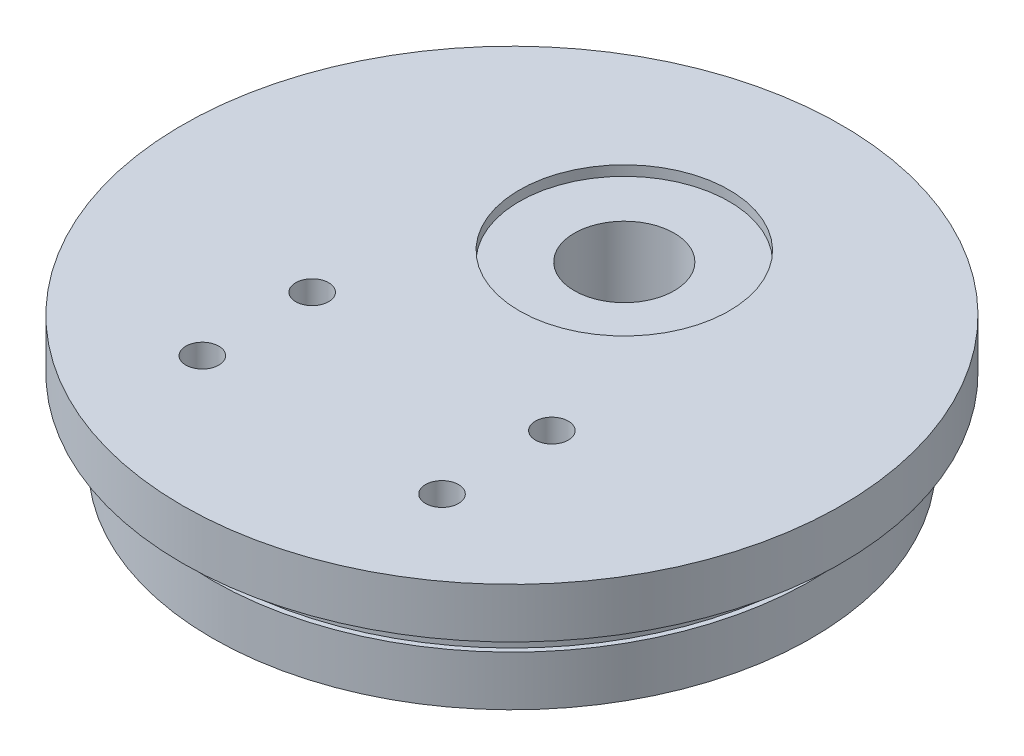
ISO-10303-21;
HEADER;
FILE_DESCRIPTION(('STEP AP214'),'2;1');
FILE_NAME('part.step','',(''),(''),'','','');
FILE_SCHEMA(('AUTOMOTIVE_DESIGN { 1 0 10303 214 1 1 1 1 }'));
ENDSEC;
DATA;
#1=APPLICATION_CONTEXT('core data for automotive mechanical design processes');
#2=APPLICATION_PROTOCOL_DEFINITION('international standard','automotive_design',2000,#1);
#3=PRODUCT_CONTEXT('',#1,'mechanical');
#4=PRODUCT('Part','Part','',(#3));
#5=PRODUCT_RELATED_PRODUCT_CATEGORY('part','',(#4));
#6=PRODUCT_DEFINITION_FORMATION('','',#4);
#7=PRODUCT_DEFINITION_CONTEXT('part definition',#1,'design');
#8=PRODUCT_DEFINITION('design','',#6,#7);
#9=PRODUCT_DEFINITION_SHAPE('','',#8);
#10=(LENGTH_UNIT() NAMED_UNIT(*) SI_UNIT(.MILLI.,.METRE.));
#11=(NAMED_UNIT(*) PLANE_ANGLE_UNIT() SI_UNIT($,.RADIAN.));
#12=(NAMED_UNIT(*) SI_UNIT($,.STERADIAN.) SOLID_ANGLE_UNIT());
#13=UNCERTAINTY_MEASURE_WITH_UNIT(LENGTH_MEASURE(1.E-05),#10,'distance_accuracy_value','');
#14=(GEOMETRIC_REPRESENTATION_CONTEXT(3) GLOBAL_UNCERTAINTY_ASSIGNED_CONTEXT((#13)) GLOBAL_UNIT_ASSIGNED_CONTEXT((#10,
#11,#12)) REPRESENTATION_CONTEXT('',''));
#15=CARTESIAN_POINT('',(0.,0.,0.));
#16=DIRECTION('',(0.,0.,1.));
#17=DIRECTION('',(1.,0.,0.));
#18=AXIS2_PLACEMENT_3D('',#15,#16,#17);
#19=CARTESIAN_POINT('',(0.,-13.,-11.25));
#20=DIRECTION('',(0.,1.,0.));
#21=DIRECTION('',(0.,0.,1.));
#22=AXIS2_PLACEMENT_3D('',#19,#20,#21);
#23=CYLINDRICAL_SURFACE('',#22,5.);
#24=CARTESIAN_POINT('',(0.,-13.,-11.25));
#25=DIRECTION('',(0.,1.,0.));
#26=DIRECTION('',(0.,0.,1.));
#27=AXIS2_PLACEMENT_3D('',#24,#25,#26);
#28=CIRCLE('',#27,5.);
#29=CARTESIAN_POINT('',(0.,-13.,-6.25));
#30=VERTEX_POINT('',#29);
#31=EDGE_CURVE('E145',#30,#30,#28,.T.);
#32=CARTESIAN_POINT('',(0.,-1.,-11.25));
#33=DIRECTION('',(0.,1.,0.));
#34=DIRECTION('',(0.,0.,1.));
#35=AXIS2_PLACEMENT_3D('',#32,#33,#34);
#36=CIRCLE('',#35,5.);
#37=CARTESIAN_POINT('',(0.,-1.,-6.25));
#38=VERTEX_POINT('',#37);
#39=EDGE_CURVE('E38',#38,#38,#36,.F.);
#40=CARTESIAN_POINT('',(0.,-13.,-6.25));
#41=CARTESIAN_POINT('',(0.,-12.875,-6.25));
#42=CARTESIAN_POINT('',(0.,-12.75,-6.25));
#43=CARTESIAN_POINT('',(0.,-12.5,-6.25));
#44=CARTESIAN_POINT('',(0.,-12.375,-6.25));
#45=CARTESIAN_POINT('',(0.,-12.125,-6.25));
#46=CARTESIAN_POINT('',(0.,-12.,-6.25));
#47=CARTESIAN_POINT('',(0.,-11.75,-6.25));
#48=CARTESIAN_POINT('',(0.,-11.625,-6.25));
#49=CARTESIAN_POINT('',(0.,-11.375,-6.25));
#50=CARTESIAN_POINT('',(0.,-11.25,-6.25));
#51=CARTESIAN_POINT('',(0.,-11.,-6.25));
#52=CARTESIAN_POINT('',(0.,-10.875,-6.25));
#53=CARTESIAN_POINT('',(0.,-10.625,-6.25));
#54=CARTESIAN_POINT('',(0.,-10.5,-6.25));
#55=CARTESIAN_POINT('',(0.,-10.25,-6.25));
#56=CARTESIAN_POINT('',(0.,-10.125,-6.25));
#57=CARTESIAN_POINT('',(0.,-9.87500000000001,-6.25));
#58=CARTESIAN_POINT('',(0.,-9.75000000000001,-6.25));
#59=CARTESIAN_POINT('',(0.,-9.50000000000001,-6.25));
#60=CARTESIAN_POINT('',(0.,-9.37500000000001,-6.25));
#61=CARTESIAN_POINT('',(0.,-9.12500000000001,-6.25));
#62=CARTESIAN_POINT('',(0.,-9.00000000000001,-6.25));
#63=CARTESIAN_POINT('',(0.,-8.75,-6.25));
#64=CARTESIAN_POINT('',(0.,-8.625,-6.25));
#65=CARTESIAN_POINT('',(0.,-8.375,-6.25));
#66=CARTESIAN_POINT('',(0.,-8.25,-6.25));
#67=CARTESIAN_POINT('',(0.,-8.,-6.25));
#68=CARTESIAN_POINT('',(0.,-7.87500000000001,-6.25));
#69=CARTESIAN_POINT('',(0.,-7.62500000000001,-6.25));
#70=CARTESIAN_POINT('',(0.,-7.50000000000001,-6.25));
#71=CARTESIAN_POINT('',(0.,-7.25,-6.25));
#72=CARTESIAN_POINT('',(0.,-7.125,-6.25));
#73=CARTESIAN_POINT('',(0.,-6.875,-6.25));
#74=CARTESIAN_POINT('',(0.,-6.75,-6.25));
#75=CARTESIAN_POINT('',(0.,-6.5,-6.25));
#76=CARTESIAN_POINT('',(0.,-6.375,-6.25));
#77=CARTESIAN_POINT('',(0.,-6.125,-6.25));
#78=CARTESIAN_POINT('',(0.,-6.,-6.25));
#79=CARTESIAN_POINT('',(0.,-5.75,-6.25));
#80=CARTESIAN_POINT('',(0.,-5.625,-6.25));
#81=CARTESIAN_POINT('',(0.,-5.375,-6.25));
#82=CARTESIAN_POINT('',(0.,-5.25,-6.25));
#83=CARTESIAN_POINT('',(0.,-5.,-6.25));
#84=CARTESIAN_POINT('',(0.,-4.875,-6.25));
#85=CARTESIAN_POINT('',(0.,-4.625,-6.25));
#86=CARTESIAN_POINT('',(0.,-4.5,-6.25));
#87=CARTESIAN_POINT('',(0.,-4.25,-6.25));
#88=CARTESIAN_POINT('',(0.,-4.125,-6.25));
#89=CARTESIAN_POINT('',(0.,-3.875,-6.25));
#90=CARTESIAN_POINT('',(0.,-3.75,-6.25));
#91=CARTESIAN_POINT('',(0.,-3.5,-6.25));
#92=CARTESIAN_POINT('',(0.,-3.375,-6.25));
#93=CARTESIAN_POINT('',(0.,-3.125,-6.25));
#94=CARTESIAN_POINT('',(0.,-3.,-6.25));
#95=CARTESIAN_POINT('',(0.,-2.75,-6.25));
#96=CARTESIAN_POINT('',(0.,-2.625,-6.25));
#97=CARTESIAN_POINT('',(0.,-2.375,-6.25));
#98=CARTESIAN_POINT('',(0.,-2.25,-6.25));
#99=CARTESIAN_POINT('',(0.,-2.,-6.25));
#100=CARTESIAN_POINT('',(0.,-1.875,-6.25));
#101=CARTESIAN_POINT('',(0.,-1.625,-6.25));
#102=CARTESIAN_POINT('',(0.,-1.5,-6.25));
#103=CARTESIAN_POINT('',(0.,-1.25,-6.25));
#104=CARTESIAN_POINT('',(0.,-1.125,-6.25));
#105=CARTESIAN_POINT('',(0.,-1.,-6.25));
#106=B_SPLINE_CURVE_WITH_KNOTS('',3,(#40,#41,#42,#43,#44,#45,#46,#47,#48,#49,#50,#51,#52,#53,
#54,#55,#56,#57,#58,#59,#60,#61,#62,#63,#64,#65,#66,#67,#68,#69,#70,#71,#72,#73,#74,#75,#76,#77,
#78,#79,#80,#81,#82,#83,#84,#85,#86,#87,#88,#89,#90,#91,#92,#93,#94,#95,#96,#97,#98,#99,#100,
#101,#102,#103,#104,#105),.UNSPECIFIED.,.F.,.F.,(4,2,2,2,2,2,2,2,2,2,2,2,2,2,2,2,2,2,2,2,2,2,2,
2,2,2,2,2,2,2,2,2,4),(0.,0.374999999999999,0.749999999999999,1.125,1.5,1.875,2.25,2.625,3.,
3.375,3.75,4.125,4.5,4.875,5.25,5.625,6.,6.375,6.75,7.125,7.5,7.875,8.25,8.625,9.,9.375,9.75,
10.125,10.5,10.875,11.25,11.625,12.),.UNSPECIFIED.);
#107=EDGE_CURVE('BSEAM34',#30,#38,#106,.T.);
#108=ORIENTED_EDGE('',*,*,#31,.F.);
#109=ORIENTED_EDGE('',*,*,#39,.F.);
#110=ORIENTED_EDGE('',*,*,#107,.T.);
#111=ORIENTED_EDGE('',*,*,#107,.F.);
#112=EDGE_LOOP('',(#108,#110,#109,#111));
#113=FACE_BOUND('',#112,.T.);
#114=ADVANCED_FACE('F34',(#113),#23,.F.);
#115=CARTESIAN_POINT('',(0.,0.,0.));
#116=DIRECTION('',(0.,1.,0.));
#117=DIRECTION('',(0.,0.,1.));
#118=AXIS2_PLACEMENT_3D('',#115,#116,#117);
#119=PLANE('',#118);
#120=CARTESIAN_POINT('',(0.,0.,-11.25));
#121=DIRECTION('',(0.,1.,0.));
#122=DIRECTION('',(0.,0.,1.));
#123=AXIS2_PLACEMENT_3D('',#120,#121,#122);
#124=CIRCLE('',#123,10.5);
#125=CARTESIAN_POINT('',(0.,0.,-0.749999999999999));
#126=VERTEX_POINT('',#125);
#127=EDGE_CURVE('E173',#126,#126,#124,.T.);
#128=ORIENTED_EDGE('',*,*,#127,.F.);
#129=EDGE_LOOP('',(#128));
#130=FACE_BOUND('',#129,.T.);
#131=CARTESIAN_POINT('',(12.,0.,8.));
#132=DIRECTION('',(0.,1.,0.));
#133=DIRECTION('',(0.,0.,1.));
#134=AXIS2_PLACEMENT_3D('',#131,#132,#133);
#135=CIRCLE('',#134,1.64999999999999);
#136=CARTESIAN_POINT('',(12.,0.,9.64999999999999));
#137=VERTEX_POINT('',#136);
#138=EDGE_CURVE('E85',#137,#137,#135,.T.);
#139=ORIENTED_EDGE('',*,*,#138,.F.);
#140=EDGE_LOOP('',(#139));
#141=FACE_BOUND('',#140,.T.);
#142=CARTESIAN_POINT('',(-12.,0.,8.));
#143=DIRECTION('',(0.,1.,0.));
#144=DIRECTION('',(0.,0.,1.));
#145=AXIS2_PLACEMENT_3D('',#142,#143,#144);
#146=CIRCLE('',#145,1.64999999999999);
#147=CARTESIAN_POINT('',(-12.,0.,9.64999999999999));
#148=VERTEX_POINT('',#147);
#149=EDGE_CURVE('E84',#148,#148,#146,.T.);
#150=ORIENTED_EDGE('',*,*,#149,.F.);
#151=EDGE_LOOP('',(#150));
#152=FACE_BOUND('',#151,.T.);
#153=CARTESIAN_POINT('',(12.,0.,19.));
#154=DIRECTION('',(0.,1.,0.));
#155=DIRECTION('',(0.,0.,1.));
#156=AXIS2_PLACEMENT_3D('',#153,#154,#155);
#157=CIRCLE('',#156,1.64999999999999);
#158=CARTESIAN_POINT('',(12.,0.,20.65));
#159=VERTEX_POINT('',#158);
#160=EDGE_CURVE('E97',#159,#159,#157,.T.);
#161=ORIENTED_EDGE('',*,*,#160,.F.);
#162=EDGE_LOOP('',(#161));
#163=FACE_BOUND('',#162,.T.);
#164=CARTESIAN_POINT('',(-12.,0.,19.));
#165=DIRECTION('',(0.,1.,0.));
#166=DIRECTION('',(0.,0.,1.));
#167=AXIS2_PLACEMENT_3D('',#164,#165,#166);
#168=CIRCLE('',#167,1.64999999999999);
#169=CARTESIAN_POINT('',(-12.,0.,20.65));
#170=VERTEX_POINT('',#169);
#171=EDGE_CURVE('E103',#170,#170,#168,.T.);
#172=ORIENTED_EDGE('',*,*,#171,.F.);
#173=EDGE_LOOP('',(#172));
#174=FACE_BOUND('',#173,.T.);
#175=CARTESIAN_POINT('',(0.,0.,0.));
#176=DIRECTION('',(0.,1.,0.));
#177=DIRECTION('',(0.,0.,1.));
#178=AXIS2_PLACEMENT_3D('',#175,#176,#177);
#179=CIRCLE('',#178,33.);
#180=CARTESIAN_POINT('',(0.,0.,33.));
#181=VERTEX_POINT('',#180);
#182=EDGE_CURVE('E11',#181,#181,#179,.T.);
#183=ORIENTED_EDGE('',*,*,#182,.T.);
#184=EDGE_LOOP('',(#183));
#185=FACE_BOUND('',#184,.T.);
#186=ADVANCED_FACE('F36',(#130,#141,#152,#163,#174,#185),#119,.T.);
#187=CARTESIAN_POINT('',(0.,0.,0.));
#188=DIRECTION('',(0.,1.,0.));
#189=DIRECTION('',(0.,0.,1.));
#190=AXIS2_PLACEMENT_3D('',#187,#188,#189);
#191=CYLINDRICAL_SURFACE('',#190,33.);
#192=CARTESIAN_POINT('',(0.,-5.,0.));
#193=DIRECTION('',(0.,1.,0.));
#194=DIRECTION('',(0.,0.,1.));
#195=AXIS2_PLACEMENT_3D('',#192,#193,#194);
#196=CIRCLE('',#195,33.);
#197=CARTESIAN_POINT('',(0.,-5.,33.));
#198=VERTEX_POINT('',#197);
#199=EDGE_CURVE('E43',#198,#198,#196,.T.);
#200=ORIENTED_EDGE('',*,*,#199,.T.);
#201=EDGE_LOOP('',(#200));
#202=FACE_BOUND('',#201,.T.);
#203=ORIENTED_EDGE('',*,*,#182,.F.);
#204=EDGE_LOOP('',(#203));
#205=FACE_BOUND('',#204,.T.);
#206=ADVANCED_FACE('F154',(#202,#205),#191,.T.);
#207=CARTESIAN_POINT('',(-33.,-5.,0.));
#208=DIRECTION('',(0.,-1.,0.));
#209=DIRECTION('',(0.,0.,-1.));
#210=AXIS2_PLACEMENT_3D('',#207,#208,#209);
#211=PLANE('',#210);
#212=ORIENTED_EDGE('',*,*,#199,.F.);
#213=EDGE_LOOP('',(#212));
#214=FACE_BOUND('',#213,.T.);
#215=CARTESIAN_POINT('',(0.,-5.,0.));
#216=DIRECTION('',(0.,1.,0.));
#217=DIRECTION('',(0.,0.,1.));
#218=AXIS2_PLACEMENT_3D('',#215,#216,#217);
#219=CIRCLE('',#218,29.5);
#220=CARTESIAN_POINT('',(0.,-5.,29.5));
#221=VERTEX_POINT('',#220);
#222=EDGE_CURVE('E164',#221,#221,#219,.T.);
#223=ORIENTED_EDGE('',*,*,#222,.T.);
#224=EDGE_LOOP('',(#223));
#225=FACE_BOUND('',#224,.T.);
#226=ADVANCED_FACE('F157',(#214,#225),#211,.T.);
#227=CARTESIAN_POINT('',(0.,0.,0.));
#228=DIRECTION('',(0.,1.,0.));
#229=DIRECTION('',(0.,0.,1.));
#230=AXIS2_PLACEMENT_3D('',#227,#228,#229);
#231=CYLINDRICAL_SURFACE('',#230,30.);
#232=CARTESIAN_POINT('',(0.,-8.,0.));
#233=DIRECTION('',(0.,1.,0.));
#234=DIRECTION('',(0.,0.,1.));
#235=AXIS2_PLACEMENT_3D('',#232,#233,#234);
#236=CIRCLE('',#235,30.);
#237=CARTESIAN_POINT('',(0.,-8.,30.));
#238=VERTEX_POINT('',#237);
#239=EDGE_CURVE('E91',#238,#238,#236,.T.);
#240=ORIENTED_EDGE('',*,*,#239,.F.);
#241=EDGE_LOOP('',(#240));
#242=FACE_BOUND('',#241,.T.);
#243=CARTESIAN_POINT('',(0.,-13.,0.));
#244=DIRECTION('',(0.,1.,0.));
#245=DIRECTION('',(0.,0.,1.));
#246=AXIS2_PLACEMENT_3D('',#243,#244,#245);
#247=CIRCLE('',#246,30.);
#248=CARTESIAN_POINT('',(0.,-13.,30.));
#249=VERTEX_POINT('',#248);
#250=EDGE_CURVE('E148',#249,#249,#247,.T.);
#251=ORIENTED_EDGE('',*,*,#250,.T.);
#252=EDGE_LOOP('',(#251));
#253=FACE_BOUND('',#252,.T.);
#254=ADVANCED_FACE('F160',(#242,#253),#231,.T.);
#255=CARTESIAN_POINT('',(-30.,-13.,0.));
#256=DIRECTION('',(0.,-1.,0.));
#257=DIRECTION('',(0.,0.,-1.));
#258=AXIS2_PLACEMENT_3D('',#255,#256,#257);
#259=PLANE('',#258);
#260=CARTESIAN_POINT('',(18.75,-13.,-14.));
#261=DIRECTION('',(0.,-1.,0.));
#262=DIRECTION('',(0.,0.,-1.));
#263=AXIS2_PLACEMENT_3D('',#260,#261,#262);
#264=CIRCLE('',#263,1.65);
#265=CARTESIAN_POINT('',(18.75,-13.,-15.65));
#266=VERTEX_POINT('',#265);
#267=EDGE_CURVE('E109',#266,#266,#264,.T.);
#268=ORIENTED_EDGE('',*,*,#267,.F.);
#269=EDGE_LOOP('',(#268));
#270=FACE_BOUND('',#269,.T.);
#271=CARTESIAN_POINT('',(-18.75,-13.,-14.0000000000003));
#272=DIRECTION('',(0.,-1.,0.));
#273=DIRECTION('',(0.,0.,-1.));
#274=AXIS2_PLACEMENT_3D('',#271,#272,#273);
#275=CIRCLE('',#274,1.65);
#276=CARTESIAN_POINT('',(-18.75,-13.,-15.6500000000003));
#277=VERTEX_POINT('',#276);
#278=EDGE_CURVE('E115',#277,#277,#275,.T.);
#279=ORIENTED_EDGE('',*,*,#278,.F.);
#280=EDGE_LOOP('',(#279));
#281=FACE_BOUND('',#280,.T.);
#282=CARTESIAN_POINT('',(18.75,-13.,0.));
#283=DIRECTION('',(0.,-1.,0.));
#284=DIRECTION('',(0.,0.,-1.));
#285=AXIS2_PLACEMENT_3D('',#282,#283,#284);
#286=CIRCLE('',#285,1.65);
#287=CARTESIAN_POINT('',(18.75,-13.,-1.65));
#288=VERTEX_POINT('',#287);
#289=EDGE_CURVE('E121',#288,#288,#286,.T.);
#290=ORIENTED_EDGE('',*,*,#289,.F.);
#291=EDGE_LOOP('',(#290));
#292=FACE_BOUND('',#291,.T.);
#293=CARTESIAN_POINT('',(-18.75,-13.,-2.61943244872498E-13));
#294=DIRECTION('',(0.,-1.,0.));
#295=DIRECTION('',(0.,0.,-1.));
#296=AXIS2_PLACEMENT_3D('',#293,#294,#295);
#297=CIRCLE('',#296,1.65);
#298=CARTESIAN_POINT('',(-18.75,-13.,-1.65000000000026));
#299=VERTEX_POINT('',#298);
#300=EDGE_CURVE('E127',#299,#299,#297,.T.);
#301=ORIENTED_EDGE('',*,*,#300,.F.);
#302=EDGE_LOOP('',(#301));
#303=FACE_BOUND('',#302,.T.);
#304=CARTESIAN_POINT('',(18.7499999999999,-13.,14.));
#305=DIRECTION('',(0.,-1.,0.));
#306=DIRECTION('',(0.,0.,-1.));
#307=AXIS2_PLACEMENT_3D('',#304,#305,#306);
#308=CIRCLE('',#307,1.65);
#309=CARTESIAN_POINT('',(18.7499999999999,-13.,12.35));
#310=VERTEX_POINT('',#309);
#311=EDGE_CURVE('E133',#310,#310,#308,.T.);
#312=ORIENTED_EDGE('',*,*,#311,.F.);
#313=EDGE_LOOP('',(#312));
#314=FACE_BOUND('',#313,.T.);
#315=CARTESIAN_POINT('',(-18.7500000000001,-13.,13.9999999999997));
#316=DIRECTION('',(0.,-1.,0.));
#317=DIRECTION('',(0.,0.,-1.));
#318=AXIS2_PLACEMENT_3D('',#315,#316,#317);
#319=CIRCLE('',#318,1.65);
#320=CARTESIAN_POINT('',(-18.7500000000001,-13.,12.3499999999997));
#321=VERTEX_POINT('',#320);
#322=EDGE_CURVE('E139',#321,#321,#319,.T.);
#323=ORIENTED_EDGE('',*,*,#322,.F.);
#324=EDGE_LOOP('',(#323));
#325=FACE_BOUND('',#324,.T.);
#326=ORIENTED_EDGE('',*,*,#31,.T.);
#327=EDGE_LOOP('',(#326));
#328=FACE_BOUND('',#327,.T.);
#329=ORIENTED_EDGE('',*,*,#250,.F.);
#330=EDGE_LOOP('',(#329));
#331=FACE_BOUND('',#330,.T.);
#332=ADVANCED_FACE('F182',(#270,#281,#292,#303,#314,#325,#328,#331),#259,.T.);
#333=CARTESIAN_POINT('',(-18.7500000000001,-8.,13.9999999999997));
#334=DIRECTION('',(0.,-1.,0.));
#335=DIRECTION('',(0.,0.,-1.));
#336=AXIS2_PLACEMENT_3D('',#333,#334,#335);
#337=CONICAL_SURFACE('',#336,1.65,1.02974425867665);
#338=CARTESIAN_POINT('',(-18.7500000000001,-7.00857997860453,13.9999999999997));
#339=VERTEX_POINT('',#338);
#340=VERTEX_LOOP('',#339);
#341=FACE_BOUND('',#340,.T.);
#342=CARTESIAN_POINT('',(-18.7500000000001,-8.,13.9999999999997));
#343=DIRECTION('',(0.,-1.,0.));
#344=DIRECTION('',(0.,0.,-1.));
#345=AXIS2_PLACEMENT_3D('',#342,#343,#344);
#346=CIRCLE('',#345,1.65);
#347=CARTESIAN_POINT('',(-18.7500000000001,-8.,12.3499999999997));
#348=VERTEX_POINT('',#347);
#349=EDGE_CURVE('E142',#348,#348,#346,.T.);
#350=ORIENTED_EDGE('',*,*,#349,.T.);
#351=EDGE_LOOP('',(#350));
#352=FACE_BOUND('',#351,.T.);
#353=ADVANCED_FACE('F187',(#341,#352),#337,.F.);
#354=CARTESIAN_POINT('',(-18.7500000000001,-13.,13.9999999999997));
#355=DIRECTION('',(0.,-1.,0.));
#356=DIRECTION('',(0.,0.,-1.));
#357=AXIS2_PLACEMENT_3D('',#354,#355,#356);
#358=CYLINDRICAL_SURFACE('',#357,1.65);
#359=ORIENTED_EDGE('',*,*,#349,.F.);
#360=EDGE_LOOP('',(#359));
#361=FACE_BOUND('',#360,.T.);
#362=ORIENTED_EDGE('',*,*,#322,.T.);
#363=EDGE_LOOP('',(#362));
#364=FACE_BOUND('',#363,.T.);
#365=ADVANCED_FACE('F193',(#361,#364),#358,.F.);
#366=CARTESIAN_POINT('',(18.7499999999999,-8.,14.));
#367=DIRECTION('',(0.,-1.,0.));
#368=DIRECTION('',(0.,0.,-1.));
#369=AXIS2_PLACEMENT_3D('',#366,#367,#368);
#370=CONICAL_SURFACE('',#369,1.65,1.02974425867665);
#371=CARTESIAN_POINT('',(18.7499999999999,-7.00857997860453,14.));
#372=VERTEX_POINT('',#371);
#373=VERTEX_LOOP('',#372);
#374=FACE_BOUND('',#373,.T.);
#375=CARTESIAN_POINT('',(18.7499999999999,-8.,14.));
#376=DIRECTION('',(0.,-1.,0.));
#377=DIRECTION('',(0.,0.,-1.));
#378=AXIS2_PLACEMENT_3D('',#375,#376,#377);
#379=CIRCLE('',#378,1.65);
#380=CARTESIAN_POINT('',(18.7499999999999,-8.,12.35));
#381=VERTEX_POINT('',#380);
#382=EDGE_CURVE('E136',#381,#381,#379,.T.);
#383=ORIENTED_EDGE('',*,*,#382,.T.);
#384=EDGE_LOOP('',(#383));
#385=FACE_BOUND('',#384,.T.);
#386=ADVANCED_FACE('F209',(#374,#385),#370,.F.);
#387=CARTESIAN_POINT('',(18.7499999999999,-13.,14.));
#388=DIRECTION('',(0.,-1.,0.));
#389=DIRECTION('',(0.,0.,-1.));
#390=AXIS2_PLACEMENT_3D('',#387,#388,#389);
#391=CYLINDRICAL_SURFACE('',#390,1.65);
#392=ORIENTED_EDGE('',*,*,#382,.F.);
#393=EDGE_LOOP('',(#392));
#394=FACE_BOUND('',#393,.T.);
#395=ORIENTED_EDGE('',*,*,#311,.T.);
#396=EDGE_LOOP('',(#395));
#397=FACE_BOUND('',#396,.T.);
#398=ADVANCED_FACE('F213',(#394,#397),#391,.F.);
#399=CARTESIAN_POINT('',(-18.75,-8.,-2.61943244872498E-13));
#400=DIRECTION('',(0.,-1.,0.));
#401=DIRECTION('',(0.,0.,-1.));
#402=AXIS2_PLACEMENT_3D('',#399,#400,#401);
#403=CONICAL_SURFACE('',#402,1.65,1.02974425867665);
#404=CARTESIAN_POINT('',(-18.75,-7.00857997860453,-2.61943244872498E-13));
#405=VERTEX_POINT('',#404);
#406=VERTEX_LOOP('',#405);
#407=FACE_BOUND('',#406,.T.);
#408=CARTESIAN_POINT('',(-18.75,-8.,-2.61943244872498E-13));
#409=DIRECTION('',(0.,-1.,0.));
#410=DIRECTION('',(0.,0.,-1.));
#411=AXIS2_PLACEMENT_3D('',#408,#409,#410);
#412=CIRCLE('',#411,1.65);
#413=CARTESIAN_POINT('',(-18.75,-8.,-1.65000000000026));
#414=VERTEX_POINT('',#413);
#415=EDGE_CURVE('E130',#414,#414,#412,.T.);
#416=ORIENTED_EDGE('',*,*,#415,.T.);
#417=EDGE_LOOP('',(#416));
#418=FACE_BOUND('',#417,.T.);
#419=ADVANCED_FACE('F216',(#407,#418),#403,.F.);
#420=CARTESIAN_POINT('',(-18.75,-13.,-2.61943244872498E-13));
#421=DIRECTION('',(0.,-1.,0.));
#422=DIRECTION('',(0.,0.,-1.));
#423=AXIS2_PLACEMENT_3D('',#420,#421,#422);
#424=CYLINDRICAL_SURFACE('',#423,1.65);
#425=ORIENTED_EDGE('',*,*,#415,.F.);
#426=EDGE_LOOP('',(#425));
#427=FACE_BOUND('',#426,.T.);
#428=ORIENTED_EDGE('',*,*,#300,.T.);
#429=EDGE_LOOP('',(#428));
#430=FACE_BOUND('',#429,.T.);
#431=ADVANCED_FACE('F220',(#427,#430),#424,.F.);
#432=CARTESIAN_POINT('',(18.75,-8.,0.));
#433=DIRECTION('',(0.,-1.,0.));
#434=DIRECTION('',(0.,0.,-1.));
#435=AXIS2_PLACEMENT_3D('',#432,#433,#434);
#436=CONICAL_SURFACE('',#435,1.65,1.02974425867665);
#437=CARTESIAN_POINT('',(18.75,-7.00857997860453,0.));
#438=VERTEX_POINT('',#437);
#439=VERTEX_LOOP('',#438);
#440=FACE_BOUND('',#439,.T.);
#441=CARTESIAN_POINT('',(18.75,-8.,0.));
#442=DIRECTION('',(0.,-1.,0.));
#443=DIRECTION('',(0.,0.,-1.));
#444=AXIS2_PLACEMENT_3D('',#441,#442,#443);
#445=CIRCLE('',#444,1.65);
#446=CARTESIAN_POINT('',(18.75,-8.,-1.65));
#447=VERTEX_POINT('',#446);
#448=EDGE_CURVE('E124',#447,#447,#445,.T.);
#449=ORIENTED_EDGE('',*,*,#448,.T.);
#450=EDGE_LOOP('',(#449));
#451=FACE_BOUND('',#450,.T.);
#452=ADVANCED_FACE('F224',(#440,#451),#436,.F.);
#453=CARTESIAN_POINT('',(18.75,-13.,0.));
#454=DIRECTION('',(0.,-1.,0.));
#455=DIRECTION('',(0.,0.,-1.));
#456=AXIS2_PLACEMENT_3D('',#453,#454,#455);
#457=CYLINDRICAL_SURFACE('',#456,1.65);
#458=ORIENTED_EDGE('',*,*,#448,.F.);
#459=EDGE_LOOP('',(#458));
#460=FACE_BOUND('',#459,.T.);
#461=ORIENTED_EDGE('',*,*,#289,.T.);
#462=EDGE_LOOP('',(#461));
#463=FACE_BOUND('',#462,.T.);
#464=ADVANCED_FACE('F228',(#460,#463),#457,.F.);
#465=CARTESIAN_POINT('',(-18.75,-8.,-14.0000000000003));
#466=DIRECTION('',(0.,-1.,0.));
#467=DIRECTION('',(0.,0.,-1.));
#468=AXIS2_PLACEMENT_3D('',#465,#466,#467);
#469=CONICAL_SURFACE('',#468,1.65,1.02974425867665);
#470=CARTESIAN_POINT('',(-18.75,-7.00857997860453,-14.0000000000003));
#471=VERTEX_POINT('',#470);
#472=VERTEX_LOOP('',#471);
#473=FACE_BOUND('',#472,.T.);
#474=CARTESIAN_POINT('',(-18.75,-8.,-14.0000000000003));
#475=DIRECTION('',(0.,-1.,0.));
#476=DIRECTION('',(0.,0.,-1.));
#477=AXIS2_PLACEMENT_3D('',#474,#475,#476);
#478=CIRCLE('',#477,1.65);
#479=CARTESIAN_POINT('',(-18.75,-8.,-15.6500000000003));
#480=VERTEX_POINT('',#479);
#481=EDGE_CURVE('E118',#480,#480,#478,.T.);
#482=ORIENTED_EDGE('',*,*,#481,.T.);
#483=EDGE_LOOP('',(#482));
#484=FACE_BOUND('',#483,.T.);
#485=ADVANCED_FACE('F232',(#473,#484),#469,.F.);
#486=CARTESIAN_POINT('',(-18.75,-13.,-14.0000000000003));
#487=DIRECTION('',(0.,-1.,0.));
#488=DIRECTION('',(0.,0.,-1.));
#489=AXIS2_PLACEMENT_3D('',#486,#487,#488);
#490=CYLINDRICAL_SURFACE('',#489,1.65);
#491=ORIENTED_EDGE('',*,*,#481,.F.);
#492=EDGE_LOOP('',(#491));
#493=FACE_BOUND('',#492,.T.);
#494=ORIENTED_EDGE('',*,*,#278,.T.);
#495=EDGE_LOOP('',(#494));
#496=FACE_BOUND('',#495,.T.);
#497=ADVANCED_FACE('F236',(#493,#496),#490,.F.);
#498=CARTESIAN_POINT('',(18.75,-8.,-14.));
#499=DIRECTION('',(0.,-1.,0.));
#500=DIRECTION('',(0.,0.,-1.));
#501=AXIS2_PLACEMENT_3D('',#498,#499,#500);
#502=CONICAL_SURFACE('',#501,1.65,1.02974425867665);
#503=CARTESIAN_POINT('',(18.75,-7.00857997860453,-14.));
#504=VERTEX_POINT('',#503);
#505=VERTEX_LOOP('',#504);
#506=FACE_BOUND('',#505,.T.);
#507=CARTESIAN_POINT('',(18.75,-8.,-14.));
#508=DIRECTION('',(0.,-1.,0.));
#509=DIRECTION('',(0.,0.,-1.));
#510=AXIS2_PLACEMENT_3D('',#507,#508,#509);
#511=CIRCLE('',#510,1.65);
#512=CARTESIAN_POINT('',(18.75,-8.,-15.65));
#513=VERTEX_POINT('',#512);
#514=EDGE_CURVE('E112',#513,#513,#511,.T.);
#515=ORIENTED_EDGE('',*,*,#514,.T.);
#516=EDGE_LOOP('',(#515));
#517=FACE_BOUND('',#516,.T.);
#518=ADVANCED_FACE('F240',(#506,#517),#502,.F.);
#519=CARTESIAN_POINT('',(18.75,-13.,-14.));
#520=DIRECTION('',(0.,-1.,0.));
#521=DIRECTION('',(0.,0.,-1.));
#522=AXIS2_PLACEMENT_3D('',#519,#520,#521);
#523=CYLINDRICAL_SURFACE('',#522,1.65);
#524=ORIENTED_EDGE('',*,*,#514,.F.);
#525=EDGE_LOOP('',(#524));
#526=FACE_BOUND('',#525,.T.);
#527=ORIENTED_EDGE('',*,*,#267,.T.);
#528=EDGE_LOOP('',(#527));
#529=FACE_BOUND('',#528,.T.);
#530=ADVANCED_FACE('F244',(#526,#529),#523,.F.);
#531=CARTESIAN_POINT('',(-12.,-6.,19.));
#532=DIRECTION('',(0.,1.,0.));
#533=DIRECTION('',(0.,0.,1.));
#534=AXIS2_PLACEMENT_3D('',#531,#532,#533);
#535=CONICAL_SURFACE('',#534,1.65,1.02974425867665);
#536=CARTESIAN_POINT('',(-12.,-6.99142002139547,19.));
#537=VERTEX_POINT('',#536);
#538=VERTEX_LOOP('',#537);
#539=FACE_BOUND('',#538,.T.);
#540=CARTESIAN_POINT('',(-12.,-6.,19.));
#541=DIRECTION('',(0.,1.,0.));
#542=DIRECTION('',(0.,0.,1.));
#543=AXIS2_PLACEMENT_3D('',#540,#541,#542);
#544=CIRCLE('',#543,1.65);
#545=CARTESIAN_POINT('',(-12.,-6.,20.65));
#546=VERTEX_POINT('',#545);
#547=EDGE_CURVE('E106',#546,#546,#544,.T.);
#548=ORIENTED_EDGE('',*,*,#547,.T.);
#549=EDGE_LOOP('',(#548));
#550=FACE_BOUND('',#549,.T.);
#551=ADVANCED_FACE('F248',(#539,#550),#535,.F.);
#552=CARTESIAN_POINT('',(-12.,0.,19.));
#553=DIRECTION('',(0.,1.,0.));
#554=DIRECTION('',(0.,0.,1.));
#555=AXIS2_PLACEMENT_3D('',#552,#553,#554);
#556=CYLINDRICAL_SURFACE('',#555,1.64999999999999);
#557=ORIENTED_EDGE('',*,*,#547,.F.);
#558=EDGE_LOOP('',(#557));
#559=FACE_BOUND('',#558,.T.);
#560=ORIENTED_EDGE('',*,*,#171,.T.);
#561=EDGE_LOOP('',(#560));
#562=FACE_BOUND('',#561,.T.);
#563=ADVANCED_FACE('F252',(#559,#562),#556,.F.);
#564=CARTESIAN_POINT('',(12.,-6.,19.));
#565=DIRECTION('',(0.,1.,0.));
#566=DIRECTION('',(0.,0.,1.));
#567=AXIS2_PLACEMENT_3D('',#564,#565,#566);
#568=CONICAL_SURFACE('',#567,1.65,1.02974425867665);
#569=CARTESIAN_POINT('',(12.,-6.99142002139547,19.));
#570=VERTEX_POINT('',#569);
#571=VERTEX_LOOP('',#570);
#572=FACE_BOUND('',#571,.T.);
#573=CARTESIAN_POINT('',(12.,-6.,19.));
#574=DIRECTION('',(0.,1.,0.));
#575=DIRECTION('',(0.,0.,1.));
#576=AXIS2_PLACEMENT_3D('',#573,#574,#575);
#577=CIRCLE('',#576,1.65);
#578=CARTESIAN_POINT('',(12.,-6.,20.65));
#579=VERTEX_POINT('',#578);
#580=EDGE_CURVE('E100',#579,#579,#577,.T.);
#581=ORIENTED_EDGE('',*,*,#580,.T.);
#582=EDGE_LOOP('',(#581));
#583=FACE_BOUND('',#582,.T.);
#584=ADVANCED_FACE('F256',(#572,#583),#568,.F.);
#585=CARTESIAN_POINT('',(12.,0.,19.));
#586=DIRECTION('',(0.,1.,0.));
#587=DIRECTION('',(0.,0.,1.));
#588=AXIS2_PLACEMENT_3D('',#585,#586,#587);
#589=CYLINDRICAL_SURFACE('',#588,1.64999999999999);
#590=ORIENTED_EDGE('',*,*,#580,.F.);
#591=EDGE_LOOP('',(#590));
#592=FACE_BOUND('',#591,.T.);
#593=ORIENTED_EDGE('',*,*,#160,.T.);
#594=EDGE_LOOP('',(#593));
#595=FACE_BOUND('',#594,.T.);
#596=ADVANCED_FACE('F260',(#592,#595),#589,.F.);
#597=CARTESIAN_POINT('',(-12.,-6.,8.));
#598=DIRECTION('',(0.,1.,0.));
#599=DIRECTION('',(0.,0.,1.));
#600=AXIS2_PLACEMENT_3D('',#597,#598,#599);
#601=CONICAL_SURFACE('',#600,1.65,1.02974425867665);
#602=CARTESIAN_POINT('',(-12.,-6.99142002139547,8.));
#603=VERTEX_POINT('',#602);
#604=VERTEX_LOOP('',#603);
#605=FACE_BOUND('',#604,.T.);
#606=CARTESIAN_POINT('',(-12.,-6.,8.));
#607=DIRECTION('',(0.,1.,0.));
#608=DIRECTION('',(0.,0.,1.));
#609=AXIS2_PLACEMENT_3D('',#606,#607,#608);
#610=CIRCLE('',#609,1.65);
#611=CARTESIAN_POINT('',(-12.,-6.,9.65));
#612=VERTEX_POINT('',#611);
#613=EDGE_CURVE('E88',#612,#612,#610,.T.);
#614=ORIENTED_EDGE('',*,*,#613,.T.);
#615=EDGE_LOOP('',(#614));
#616=FACE_BOUND('',#615,.T.);
#617=ADVANCED_FACE('F264',(#605,#616),#601,.F.);
#618=CARTESIAN_POINT('',(-12.,0.,8.));
#619=DIRECTION('',(0.,1.,0.));
#620=DIRECTION('',(0.,0.,1.));
#621=AXIS2_PLACEMENT_3D('',#618,#619,#620);
#622=CYLINDRICAL_SURFACE('',#621,1.64999999999999);
#623=ORIENTED_EDGE('',*,*,#613,.F.);
#624=EDGE_LOOP('',(#623));
#625=FACE_BOUND('',#624,.T.);
#626=ORIENTED_EDGE('',*,*,#149,.T.);
#627=EDGE_LOOP('',(#626));
#628=FACE_BOUND('',#627,.T.);
#629=ADVANCED_FACE('F78',(#625,#628),#622,.F.);
#630=CARTESIAN_POINT('',(12.,-6.,8.));
#631=DIRECTION('',(0.,1.,0.));
#632=DIRECTION('',(0.,0.,1.));
#633=AXIS2_PLACEMENT_3D('',#630,#631,#632);
#634=CONICAL_SURFACE('',#633,1.65,1.02974425867665);
#635=CARTESIAN_POINT('',(12.,-6.99142002139547,8.));
#636=VERTEX_POINT('',#635);
#637=VERTEX_LOOP('',#636);
#638=FACE_BOUND('',#637,.T.);
#639=CARTESIAN_POINT('',(12.,-6.,8.));
#640=DIRECTION('',(0.,1.,0.));
#641=DIRECTION('',(0.,0.,1.));
#642=AXIS2_PLACEMENT_3D('',#639,#640,#641);
#643=CIRCLE('',#642,1.65);
#644=CARTESIAN_POINT('',(12.,-6.,9.65));
#645=VERTEX_POINT('',#644);
#646=EDGE_CURVE('E82',#645,#645,#643,.T.);
#647=ORIENTED_EDGE('',*,*,#646,.T.);
#648=EDGE_LOOP('',(#647));
#649=FACE_BOUND('',#648,.T.);
#650=ADVANCED_FACE('F74',(#638,#649),#634,.F.);
#651=CARTESIAN_POINT('',(12.,0.,8.));
#652=DIRECTION('',(0.,1.,0.));
#653=DIRECTION('',(0.,0.,1.));
#654=AXIS2_PLACEMENT_3D('',#651,#652,#653);
#655=CYLINDRICAL_SURFACE('',#654,1.64999999999999);
#656=ORIENTED_EDGE('',*,*,#646,.F.);
#657=EDGE_LOOP('',(#656));
#658=FACE_BOUND('',#657,.T.);
#659=ORIENTED_EDGE('',*,*,#138,.T.);
#660=EDGE_LOOP('',(#659));
#661=FACE_BOUND('',#660,.T.);
#662=ADVANCED_FACE('F77',(#658,#661),#655,.F.);
#663=CARTESIAN_POINT('',(-30.,-8.,0.));
#664=DIRECTION('',(0.,-1.,0.));
#665=DIRECTION('',(0.,0.,-1.));
#666=AXIS2_PLACEMENT_3D('',#663,#664,#665);
#667=PLANE('',#666);
#668=CARTESIAN_POINT('',(0.,-8.,0.));
#669=DIRECTION('',(0.,1.,0.));
#670=DIRECTION('',(0.,0.,1.));
#671=AXIS2_PLACEMENT_3D('',#668,#669,#670);
#672=CIRCLE('',#671,29.5);
#673=CARTESIAN_POINT('',(0.,-8.,29.5));
#674=VERTEX_POINT('',#673);
#675=EDGE_CURVE('E166',#674,#674,#672,.T.);
#676=ORIENTED_EDGE('',*,*,#675,.F.);
#677=EDGE_LOOP('',(#676));
#678=FACE_BOUND('',#677,.T.);
#679=ORIENTED_EDGE('',*,*,#239,.T.);
#680=EDGE_LOOP('',(#679));
#681=FACE_BOUND('',#680,.T.);
#682=ADVANCED_FACE('F178',(#678,#681),#667,.F.);
#683=CARTESIAN_POINT('',(0.,0.,0.));
#684=DIRECTION('',(0.,1.,0.));
#685=DIRECTION('',(0.,0.,1.));
#686=AXIS2_PLACEMENT_3D('',#683,#684,#685);
#687=CYLINDRICAL_SURFACE('',#686,29.5);
#688=ORIENTED_EDGE('',*,*,#222,.F.);
#689=EDGE_LOOP('',(#688));
#690=FACE_BOUND('',#689,.T.);
#691=ORIENTED_EDGE('',*,*,#675,.T.);
#692=EDGE_LOOP('',(#691));
#693=FACE_BOUND('',#692,.T.);
#694=ADVANCED_FACE('F276',(#690,#693),#687,.T.);
#695=CARTESIAN_POINT('',(0.,-1.,-11.25));
#696=DIRECTION('',(0.,1.,0.));
#697=DIRECTION('',(0.,0.,1.));
#698=AXIS2_PLACEMENT_3D('',#695,#696,#697);
#699=PLANE('',#698);
#700=CARTESIAN_POINT('',(0.,-1.,-11.25));
#701=DIRECTION('',(0.,1.,0.));
#702=DIRECTION('',(0.,0.,1.));
#703=AXIS2_PLACEMENT_3D('',#700,#701,#702);
#704=CIRCLE('',#703,10.5);
#705=CARTESIAN_POINT('',(0.,-1.,-0.749999999999999));
#706=VERTEX_POINT('',#705);
#707=EDGE_CURVE('E171',#706,#706,#704,.T.);
#708=ORIENTED_EDGE('',*,*,#707,.T.);
#709=EDGE_LOOP('',(#708));
#710=FACE_BOUND('',#709,.T.);
#711=ORIENTED_EDGE('',*,*,#39,.T.);
#712=EDGE_LOOP('',(#711));
#713=FACE_BOUND('',#712,.T.);
#714=ADVANCED_FACE('F280',(#710,#713),#699,.T.);
#715=CARTESIAN_POINT('',(0.,-1.,-11.25));
#716=DIRECTION('',(0.,1.,0.));
#717=DIRECTION('',(0.,0.,1.));
#718=AXIS2_PLACEMENT_3D('',#715,#716,#717);
#719=CYLINDRICAL_SURFACE('',#718,10.5);
#720=ORIENTED_EDGE('',*,*,#707,.F.);
#721=EDGE_LOOP('',(#720));
#722=FACE_BOUND('',#721,.T.);
#723=ORIENTED_EDGE('',*,*,#127,.T.);
#724=EDGE_LOOP('',(#723));
#725=FACE_BOUND('',#724,.T.);
#726=ADVANCED_FACE('F281',(#722,#725),#719,.F.);
#727=CLOSED_SHELL('',(#114,#186,#206,#226,#254,#332,#353,#365,#386,#398,#419,#431,#452,#464,
#485,#497,#518,#530,#551,#563,#584,#596,#617,#629,#650,#662,#682,#694,#714,#726));
#728=MANIFOLD_SOLID_BREP('B2',#727);
#729=ADVANCED_BREP_SHAPE_REPRESENTATION('',(#18,#728),#14);
#730=SHAPE_DEFINITION_REPRESENTATION(#9,#729);
ENDSEC;
END-ISO-10303-21;
